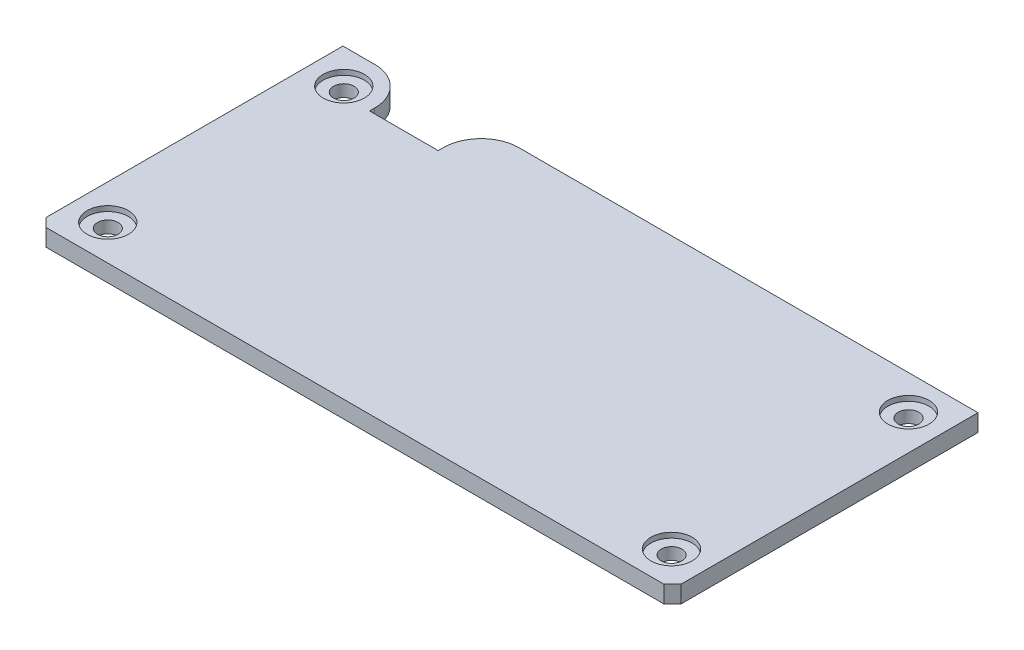
ISO-10303-21;
HEADER;
FILE_DESCRIPTION(('STEP AP214'),'2;1');
FILE_NAME('part.step','',(''),(''),'','','');
FILE_SCHEMA(('AUTOMOTIVE_DESIGN { 1 0 10303 214 1 1 1 1 }'));
ENDSEC;
DATA;
#1=APPLICATION_CONTEXT('core data for automotive mechanical design processes');
#2=APPLICATION_PROTOCOL_DEFINITION('international standard','automotive_design',2000,#1);
#3=PRODUCT_CONTEXT('',#1,'mechanical');
#4=PRODUCT('Part','Part','',(#3));
#5=PRODUCT_RELATED_PRODUCT_CATEGORY('part','',(#4));
#6=PRODUCT_DEFINITION_FORMATION('','',#4);
#7=PRODUCT_DEFINITION_CONTEXT('part definition',#1,'design');
#8=PRODUCT_DEFINITION('design','',#6,#7);
#9=PRODUCT_DEFINITION_SHAPE('','',#8);
#10=(LENGTH_UNIT() NAMED_UNIT(*) SI_UNIT(.MILLI.,.METRE.));
#11=(NAMED_UNIT(*) PLANE_ANGLE_UNIT() SI_UNIT($,.RADIAN.));
#12=(NAMED_UNIT(*) SI_UNIT($,.STERADIAN.) SOLID_ANGLE_UNIT());
#13=UNCERTAINTY_MEASURE_WITH_UNIT(LENGTH_MEASURE(1.E-05),#10,'distance_accuracy_value','');
#14=(GEOMETRIC_REPRESENTATION_CONTEXT(3) GLOBAL_UNCERTAINTY_ASSIGNED_CONTEXT((#13)) GLOBAL_UNIT_ASSIGNED_CONTEXT((#10,
#11,#12)) REPRESENTATION_CONTEXT('',''));
#15=CARTESIAN_POINT('',(0.,0.,0.));
#16=DIRECTION('',(0.,0.,1.));
#17=DIRECTION('',(1.,0.,0.));
#18=AXIS2_PLACEMENT_3D('',#15,#16,#17);
#19=CARTESIAN_POINT('',(-37.,2.,-17.8));
#20=DIRECTION('',(0.,0.,1.));
#21=DIRECTION('',(1.,0.,0.));
#22=AXIS2_PLACEMENT_3D('',#19,#20,#21);
#23=PLANE('',#22);
#24=DIRECTION('',(-1.,0.,0.));
#25=VECTOR('',#24,1.);
#26=CARTESIAN_POINT('',(-37.,0.,-17.8));
#27=LINE('',#26,#25);
#28=CARTESIAN_POINT('',(37.,0.,-17.8));
#29=VERTEX_POINT('',#28);
#30=CARTESIAN_POINT('',(-16.5,0.,-17.8));
#31=VERTEX_POINT('',#30);
#32=EDGE_CURVE('E242',#29,#31,#27,.T.);
#33=ORIENTED_EDGE('',*,*,#32,.T.);
#34=DIRECTION('',(0.,1.,0.));
#35=VECTOR('',#34,1.);
#36=CARTESIAN_POINT('',(-16.5,2.,-17.8));
#37=LINE('',#36,#35);
#38=CARTESIAN_POINT('',(-16.5,2.,-17.8));
#39=VERTEX_POINT('',#38);
#40=EDGE_CURVE('E286',#31,#39,#37,.T.);
#41=ORIENTED_EDGE('',*,*,#40,.T.);
#42=DIRECTION('',(-1.,0.,0.));
#43=VECTOR('',#42,1.);
#44=CARTESIAN_POINT('',(-37.,2.,-17.8));
#45=LINE('',#44,#43);
#46=CARTESIAN_POINT('',(37.,2.,-17.8));
#47=VERTEX_POINT('',#46);
#48=EDGE_CURVE('E226',#47,#39,#45,.T.);
#49=ORIENTED_EDGE('',*,*,#48,.F.);
#50=DIRECTION('',(0.,-1.,0.));
#51=VECTOR('',#50,1.);
#52=CARTESIAN_POINT('',(37.,2.,-17.8));
#53=LINE('',#52,#51);
#54=EDGE_CURVE('E256',#47,#29,#53,.T.);
#55=ORIENTED_EDGE('',*,*,#54,.T.);
#56=EDGE_LOOP('',(#33,#41,#49,#55));
#57=FACE_BOUND('',#56,.T.);
#58=ADVANCED_FACE('F41',(#57),#23,.F.);
#59=CARTESIAN_POINT('',(32.9045607646162,0.,13.813886845355));
#60=DIRECTION('',(0.,1.,0.));
#61=DIRECTION('',(0.,0.,1.));
#62=AXIS2_PLACEMENT_3D('',#59,#60,#61);
#63=CYLINDRICAL_SURFACE('',#62,1.2);
#64=CARTESIAN_POINT('',(32.9045607646162,0.,13.813886845355));
#65=DIRECTION('',(0.,1.,0.));
#66=DIRECTION('',(0.,0.,1.));
#67=AXIS2_PLACEMENT_3D('',#64,#65,#66);
#68=CIRCLE('',#67,1.2);
#69=CARTESIAN_POINT('',(32.9045607646162,0.,15.013886845355));
#70=VERTEX_POINT('',#69);
#71=EDGE_CURVE('E207',#70,#70,#68,.T.);
#72=ORIENTED_EDGE('',*,*,#71,.F.);
#73=EDGE_LOOP('',(#72));
#74=FACE_BOUND('',#73,.T.);
#75=CARTESIAN_POINT('',(32.9045607646162,1.4,13.813886845355));
#76=DIRECTION('',(0.,1.,0.));
#77=DIRECTION('',(0.,0.,1.));
#78=AXIS2_PLACEMENT_3D('',#75,#76,#77);
#79=CIRCLE('',#78,1.2);
#80=CARTESIAN_POINT('',(32.9045607646162,1.4,15.013886845355));
#81=VERTEX_POINT('',#80);
#82=EDGE_CURVE('E216',#81,#81,#79,.F.);
#83=ORIENTED_EDGE('',*,*,#82,.F.);
#84=EDGE_LOOP('',(#83));
#85=FACE_BOUND('',#84,.T.);
#86=ADVANCED_FACE('F364',(#74,#85),#63,.F.);
#87=CARTESIAN_POINT('',(-32.9,0.,13.7));
#88=DIRECTION('',(0.,1.,0.));
#89=DIRECTION('',(0.,0.,1.));
#90=AXIS2_PLACEMENT_3D('',#87,#88,#89);
#91=CYLINDRICAL_SURFACE('',#90,1.2);
#92=CARTESIAN_POINT('',(-32.9,0.,13.7));
#93=DIRECTION('',(0.,1.,0.));
#94=DIRECTION('',(0.,0.,1.));
#95=AXIS2_PLACEMENT_3D('',#92,#93,#94);
#96=CIRCLE('',#95,1.2);
#97=CARTESIAN_POINT('',(-32.9,0.,14.9));
#98=VERTEX_POINT('',#97);
#99=EDGE_CURVE('E203',#98,#98,#96,.T.);
#100=ORIENTED_EDGE('',*,*,#99,.F.);
#101=EDGE_LOOP('',(#100));
#102=FACE_BOUND('',#101,.T.);
#103=CARTESIAN_POINT('',(-32.9,1.4,13.7));
#104=DIRECTION('',(0.,1.,0.));
#105=DIRECTION('',(0.,0.,1.));
#106=AXIS2_PLACEMENT_3D('',#103,#104,#105);
#107=CIRCLE('',#106,1.2);
#108=CARTESIAN_POINT('',(-32.9,1.4,14.9));
#109=VERTEX_POINT('',#108);
#110=EDGE_CURVE('E294',#109,#109,#107,.F.);
#111=ORIENTED_EDGE('',*,*,#110,.F.);
#112=EDGE_LOOP('',(#111));
#113=FACE_BOUND('',#112,.T.);
#114=ADVANCED_FACE('F369',(#102,#113),#91,.F.);
#115=CARTESIAN_POINT('',(-32.9,0.,-13.7990980076637));
#116=DIRECTION('',(0.,1.,0.));
#117=DIRECTION('',(0.,0.,1.));
#118=AXIS2_PLACEMENT_3D('',#115,#116,#117);
#119=CYLINDRICAL_SURFACE('',#118,1.2);
#120=CARTESIAN_POINT('',(-32.9,0.,-13.7990980076637));
#121=DIRECTION('',(0.,1.,0.));
#122=DIRECTION('',(0.,0.,1.));
#123=AXIS2_PLACEMENT_3D('',#120,#121,#122);
#124=CIRCLE('',#123,1.2);
#125=CARTESIAN_POINT('',(-32.9,0.,-12.5990980076637));
#126=VERTEX_POINT('',#125);
#127=EDGE_CURVE('E208',#126,#126,#124,.T.);
#128=ORIENTED_EDGE('',*,*,#127,.F.);
#129=EDGE_LOOP('',(#128));
#130=FACE_BOUND('',#129,.T.);
#131=CARTESIAN_POINT('',(-32.9,1.4,-13.7990980076637));
#132=DIRECTION('',(0.,1.,0.));
#133=DIRECTION('',(0.,0.,1.));
#134=AXIS2_PLACEMENT_3D('',#131,#132,#133);
#135=CIRCLE('',#134,1.2);
#136=CARTESIAN_POINT('',(-32.9,1.4,-12.5990980076637));
#137=VERTEX_POINT('',#136);
#138=EDGE_CURVE('E290',#137,#137,#135,.F.);
#139=ORIENTED_EDGE('',*,*,#138,.F.);
#140=EDGE_LOOP('',(#139));
#141=FACE_BOUND('',#140,.T.);
#142=ADVANCED_FACE('F383',(#130,#141),#119,.F.);
#143=CARTESIAN_POINT('',(32.9,0.,-13.7990980076637));
#144=DIRECTION('',(0.,1.,0.));
#145=DIRECTION('',(0.,0.,1.));
#146=AXIS2_PLACEMENT_3D('',#143,#144,#145);
#147=CYLINDRICAL_SURFACE('',#146,1.2);
#148=CARTESIAN_POINT('',(32.9,0.,-13.7990980076637));
#149=DIRECTION('',(0.,1.,0.));
#150=DIRECTION('',(0.,0.,1.));
#151=AXIS2_PLACEMENT_3D('',#148,#149,#150);
#152=CIRCLE('',#151,1.2);
#153=CARTESIAN_POINT('',(32.9,0.,-12.5990980076637));
#154=VERTEX_POINT('',#153);
#155=EDGE_CURVE('E212',#154,#154,#152,.T.);
#156=ORIENTED_EDGE('',*,*,#155,.F.);
#157=EDGE_LOOP('',(#156));
#158=FACE_BOUND('',#157,.T.);
#159=CARTESIAN_POINT('',(32.9,1.4,-13.7990980076637));
#160=DIRECTION('',(0.,1.,0.));
#161=DIRECTION('',(0.,0.,1.));
#162=AXIS2_PLACEMENT_3D('',#159,#160,#161);
#163=CIRCLE('',#162,1.2);
#164=CARTESIAN_POINT('',(32.9,1.4,-12.5990980076637));
#165=VERTEX_POINT('',#164);
#166=EDGE_CURVE('E199',#165,#165,#163,.F.);
#167=ORIENTED_EDGE('',*,*,#166,.F.);
#168=EDGE_LOOP('',(#167));
#169=FACE_BOUND('',#168,.T.);
#170=ADVANCED_FACE('F379',(#158,#169),#147,.F.);
#171=CARTESIAN_POINT('',(37.,2.,-17.8));
#172=DIRECTION('',(-1.,0.,0.));
#173=DIRECTION('',(0.,0.,1.));
#174=AXIS2_PLACEMENT_3D('',#171,#172,#173);
#175=PLANE('',#174);
#176=DIRECTION('',(0.,0.,-1.));
#177=VECTOR('',#176,1.);
#178=CARTESIAN_POINT('',(37.,2.,-17.8));
#179=LINE('',#178,#177);
#180=CARTESIAN_POINT('',(37.,2.,16.8));
#181=VERTEX_POINT('',#180);
#182=EDGE_CURVE('E221',#181,#47,#179,.T.);
#183=ORIENTED_EDGE('',*,*,#182,.F.);
#184=DIRECTION('',(0.,-1.,0.));
#185=VECTOR('',#184,1.);
#186=CARTESIAN_POINT('',(37.,2.,16.8));
#187=LINE('',#186,#185);
#188=CARTESIAN_POINT('',(37.,0.,16.8));
#189=VERTEX_POINT('',#188);
#190=EDGE_CURVE('E260',#181,#189,#187,.T.);
#191=ORIENTED_EDGE('',*,*,#190,.T.);
#192=DIRECTION('',(0.,0.,-1.));
#193=VECTOR('',#192,1.);
#194=CARTESIAN_POINT('',(37.,0.,-17.8));
#195=LINE('',#194,#193);
#196=EDGE_CURVE('E220',#189,#29,#195,.T.);
#197=ORIENTED_EDGE('',*,*,#196,.T.);
#198=ORIENTED_EDGE('',*,*,#54,.F.);
#199=EDGE_LOOP('',(#183,#191,#197,#198));
#200=FACE_BOUND('',#199,.T.);
#201=ADVANCED_FACE('F336',(#200),#175,.F.);
#202=CARTESIAN_POINT('',(-33.3,2.,-17.8));
#203=VERTEX_POINT('',#202);
#204=CARTESIAN_POINT('',(-37.,2.,-17.8));
#205=VERTEX_POINT('',#204);
#206=EDGE_CURVE('E224',#203,#205,#45,.T.);
#207=ORIENTED_EDGE('',*,*,#206,.F.);
#208=DIRECTION('',(0.,1.,0.));
#209=VECTOR('',#208,1.);
#210=CARTESIAN_POINT('',(-33.3,2.,-17.8));
#211=LINE('',#210,#209);
#212=CARTESIAN_POINT('',(-33.3,0.,-17.8));
#213=VERTEX_POINT('',#212);
#214=EDGE_CURVE('E11',#203,#213,#211,.F.);
#215=ORIENTED_EDGE('',*,*,#214,.T.);
#216=CARTESIAN_POINT('',(-37.,0.,-17.8));
#217=VERTEX_POINT('',#216);
#218=EDGE_CURVE('E241',#213,#217,#27,.T.);
#219=ORIENTED_EDGE('',*,*,#218,.T.);
#220=DIRECTION('',(0.,-1.,0.));
#221=VECTOR('',#220,1.);
#222=CARTESIAN_POINT('',(-37.,2.,-17.8));
#223=LINE('',#222,#221);
#224=EDGE_CURVE('E238',#205,#217,#223,.T.);
#225=ORIENTED_EDGE('',*,*,#224,.F.);
#226=EDGE_LOOP('',(#207,#215,#219,#225));
#227=FACE_BOUND('',#226,.T.);
#228=ADVANCED_FACE('F356',(#227),#23,.F.);
#229=CARTESIAN_POINT('',(-37.,2.,-17.8));
#230=DIRECTION('',(1.,0.,0.));
#231=DIRECTION('',(0.,0.,-1.));
#232=AXIS2_PLACEMENT_3D('',#229,#230,#231);
#233=PLANE('',#232);
#234=DIRECTION('',(0.,0.,1.));
#235=VECTOR('',#234,1.);
#236=CARTESIAN_POINT('',(-37.,0.,-17.8));
#237=LINE('',#236,#235);
#238=CARTESIAN_POINT('',(-37.,0.,16.8));
#239=VERTEX_POINT('',#238);
#240=EDGE_CURVE('E246',#217,#239,#237,.T.);
#241=ORIENTED_EDGE('',*,*,#240,.T.);
#242=DIRECTION('',(0.,1.,0.));
#243=VECTOR('',#242,1.);
#244=CARTESIAN_POINT('',(-37.,2.,16.8));
#245=LINE('',#244,#243);
#246=CARTESIAN_POINT('',(-37.,2.,16.8));
#247=VERTEX_POINT('',#246);
#248=EDGE_CURVE('E283',#239,#247,#245,.T.);
#249=ORIENTED_EDGE('',*,*,#248,.T.);
#250=DIRECTION('',(0.,0.,1.));
#251=VECTOR('',#250,1.);
#252=CARTESIAN_POINT('',(-37.,2.,-17.8));
#253=LINE('',#252,#251);
#254=EDGE_CURVE('E230',#205,#247,#253,.T.);
#255=ORIENTED_EDGE('',*,*,#254,.F.);
#256=ORIENTED_EDGE('',*,*,#224,.T.);
#257=EDGE_LOOP('',(#241,#249,#255,#256));
#258=FACE_BOUND('',#257,.T.);
#259=ADVANCED_FACE('F353',(#258),#233,.F.);
#260=CARTESIAN_POINT('',(-37.,2.,17.8));
#261=DIRECTION('',(0.,0.,-1.));
#262=DIRECTION('',(-1.,0.,0.));
#263=AXIS2_PLACEMENT_3D('',#260,#261,#262);
#264=PLANE('',#263);
#265=DIRECTION('',(1.,0.,0.));
#266=VECTOR('',#265,1.);
#267=CARTESIAN_POINT('',(-37.,0.,17.8));
#268=LINE('',#267,#266);
#269=CARTESIAN_POINT('',(-36.,0.,17.8));
#270=VERTEX_POINT('',#269);
#271=CARTESIAN_POINT('',(36.,0.,17.8));
#272=VERTEX_POINT('',#271);
#273=EDGE_CURVE('E225',#270,#272,#268,.T.);
#274=ORIENTED_EDGE('',*,*,#273,.T.);
#275=DIRECTION('',(0.,1.,0.));
#276=VECTOR('',#275,1.);
#277=CARTESIAN_POINT('',(36.,2.,17.8));
#278=LINE('',#277,#276);
#279=CARTESIAN_POINT('',(36.,2.,17.8));
#280=VERTEX_POINT('',#279);
#281=EDGE_CURVE('E274',#272,#280,#278,.T.);
#282=ORIENTED_EDGE('',*,*,#281,.T.);
#283=DIRECTION('',(1.,0.,0.));
#284=VECTOR('',#283,1.);
#285=CARTESIAN_POINT('',(-37.,2.,17.8));
#286=LINE('',#285,#284);
#287=CARTESIAN_POINT('',(-36.,2.,17.8));
#288=VERTEX_POINT('',#287);
#289=EDGE_CURVE('E234',#288,#280,#286,.T.);
#290=ORIENTED_EDGE('',*,*,#289,.F.);
#291=DIRECTION('',(0.,-1.,0.));
#292=VECTOR('',#291,1.);
#293=CARTESIAN_POINT('',(-36.,2.,17.8));
#294=LINE('',#293,#292);
#295=EDGE_CURVE('E270',#288,#270,#294,.T.);
#296=ORIENTED_EDGE('',*,*,#295,.T.);
#297=EDGE_LOOP('',(#274,#282,#290,#296));
#298=FACE_BOUND('',#297,.T.);
#299=ADVANCED_FACE('F342',(#298),#264,.F.);
#300=CARTESIAN_POINT('',(0.,2.,0.));
#301=DIRECTION('',(0.,1.,0.));
#302=DIRECTION('',(0.,0.,1.));
#303=AXIS2_PLACEMENT_3D('',#300,#301,#302);
#304=PLANE('',#303);
#305=ORIENTED_EDGE('',*,*,#48,.T.);
#306=CARTESIAN_POINT('',(-16.5,2.,-13.4));
#307=DIRECTION('',(0.,1.,0.));
#308=DIRECTION('',(0.,0.,1.));
#309=AXIS2_PLACEMENT_3D('',#306,#307,#308);
#310=CIRCLE('',#309,4.4);
#311=CARTESIAN_POINT('',(-20.9,2.,-13.4));
#312=VERTEX_POINT('',#311);
#313=EDGE_CURVE('E307',#39,#312,#310,.T.);
#314=ORIENTED_EDGE('',*,*,#313,.T.);
#315=DIRECTION('',(0.,0.,-1.));
#316=VECTOR('',#315,1.);
#317=CARTESIAN_POINT('',(-20.9,2.,-12.8));
#318=LINE('',#317,#316);
#319=CARTESIAN_POINT('',(-20.9,2.,-12.8));
#320=VERTEX_POINT('',#319);
#321=EDGE_CURVE('E163',#320,#312,#318,.T.);
#322=ORIENTED_EDGE('',*,*,#321,.F.);
#323=DIRECTION('',(1.,0.,0.));
#324=VECTOR('',#323,1.);
#325=CARTESIAN_POINT('',(-20.9,2.,-12.8));
#326=LINE('',#325,#324);
#327=CARTESIAN_POINT('',(-28.9,2.,-12.8));
#328=VERTEX_POINT('',#327);
#329=EDGE_CURVE('E138',#328,#320,#326,.T.);
#330=ORIENTED_EDGE('',*,*,#329,.F.);
#331=DIRECTION('',(0.,0.,1.));
#332=VECTOR('',#331,1.);
#333=CARTESIAN_POINT('',(-28.9,2.,-12.8));
#334=LINE('',#333,#332);
#335=CARTESIAN_POINT('',(-28.9,2.,-13.4));
#336=VERTEX_POINT('',#335);
#337=EDGE_CURVE('E166',#336,#328,#334,.T.);
#338=ORIENTED_EDGE('',*,*,#337,.F.);
#339=CARTESIAN_POINT('',(-33.3,2.,-13.4));
#340=DIRECTION('',(0.,1.,0.));
#341=DIRECTION('',(0.,0.,1.));
#342=AXIS2_PLACEMENT_3D('',#339,#340,#341);
#343=CIRCLE('',#342,4.4);
#344=EDGE_CURVE('E304',#336,#203,#343,.T.);
#345=ORIENTED_EDGE('',*,*,#344,.T.);
#346=ORIENTED_EDGE('',*,*,#206,.T.);
#347=ORIENTED_EDGE('',*,*,#254,.T.);
#348=DIRECTION('',(-0.707106781186543,0.,-0.707106781186552));
#349=VECTOR('',#348,1.);
#350=CARTESIAN_POINT('',(-26.9000000000003,2.,26.8999999999999));
#351=LINE('',#350,#349);
#352=EDGE_CURVE('E277',#247,#288,#351,.F.);
#353=ORIENTED_EDGE('',*,*,#352,.T.);
#354=ORIENTED_EDGE('',*,*,#289,.T.);
#355=DIRECTION('',(-0.707106781186552,0.,0.707106781186543));
#356=VECTOR('',#355,1.);
#357=CARTESIAN_POINT('',(26.8999999999997,2.,26.9000000000001));
#358=LINE('',#357,#356);
#359=EDGE_CURVE('E280',#280,#181,#358,.F.);
#360=ORIENTED_EDGE('',*,*,#359,.T.);
#361=ORIENTED_EDGE('',*,*,#182,.T.);
#362=EDGE_LOOP('',(#305,#314,#322,#330,#338,#345,#346,#347,#353,#354,#360,#361));
#363=FACE_BOUND('',#362,.T.);
#364=CARTESIAN_POINT('',(-32.9,2.,13.7));
#365=DIRECTION('',(0.,1.,0.));
#366=DIRECTION('',(0.,0.,1.));
#367=AXIS2_PLACEMENT_3D('',#364,#365,#366);
#368=CIRCLE('',#367,2.4);
#369=CARTESIAN_POINT('',(-32.9,2.,16.1));
#370=VERTEX_POINT('',#369);
#371=EDGE_CURVE('E184',#370,#370,#368,.T.);
#372=ORIENTED_EDGE('',*,*,#371,.F.);
#373=EDGE_LOOP('',(#372));
#374=FACE_BOUND('',#373,.T.);
#375=CARTESIAN_POINT('',(32.9,2.,-13.7990980076637));
#376=DIRECTION('',(0.,1.,0.));
#377=DIRECTION('',(0.,0.,1.));
#378=AXIS2_PLACEMENT_3D('',#375,#376,#377);
#379=CIRCLE('',#378,2.4);
#380=CARTESIAN_POINT('',(32.9,2.,-11.3990980076637));
#381=VERTEX_POINT('',#380);
#382=EDGE_CURVE('E175',#381,#381,#379,.T.);
#383=ORIENTED_EDGE('',*,*,#382,.F.);
#384=EDGE_LOOP('',(#383));
#385=FACE_BOUND('',#384,.T.);
#386=CARTESIAN_POINT('',(-32.9,2.,-13.7990980076637));
#387=DIRECTION('',(0.,1.,0.));
#388=DIRECTION('',(0.,0.,1.));
#389=AXIS2_PLACEMENT_3D('',#386,#387,#388);
#390=CIRCLE('',#389,2.4);
#391=CARTESIAN_POINT('',(-32.9,2.,-11.3990980076637));
#392=VERTEX_POINT('',#391);
#393=EDGE_CURVE('E143',#392,#392,#390,.T.);
#394=ORIENTED_EDGE('',*,*,#393,.F.);
#395=EDGE_LOOP('',(#394));
#396=FACE_BOUND('',#395,.T.);
#397=CARTESIAN_POINT('',(32.9045607646162,2.,13.813886845355));
#398=DIRECTION('',(0.,1.,0.));
#399=DIRECTION('',(0.,0.,1.));
#400=AXIS2_PLACEMENT_3D('',#397,#398,#399);
#401=CIRCLE('',#400,2.4);
#402=CARTESIAN_POINT('',(32.9045607646162,2.,16.213886845355));
#403=VERTEX_POINT('',#402);
#404=EDGE_CURVE('E183',#403,#403,#401,.T.);
#405=ORIENTED_EDGE('',*,*,#404,.F.);
#406=EDGE_LOOP('',(#405));
#407=FACE_BOUND('',#406,.T.);
#408=ADVANCED_FACE('F324',(#363,#374,#385,#396,#407),#304,.T.);
#409=CARTESIAN_POINT('',(0.,0.,0.));
#410=DIRECTION('',(0.,1.,0.));
#411=DIRECTION('',(0.,0.,1.));
#412=AXIS2_PLACEMENT_3D('',#409,#410,#411);
#413=PLANE('',#412);
#414=ORIENTED_EDGE('',*,*,#155,.T.);
#415=EDGE_LOOP('',(#414));
#416=FACE_BOUND('',#415,.T.);
#417=ORIENTED_EDGE('',*,*,#127,.T.);
#418=EDGE_LOOP('',(#417));
#419=FACE_BOUND('',#418,.T.);
#420=ORIENTED_EDGE('',*,*,#99,.T.);
#421=EDGE_LOOP('',(#420));
#422=FACE_BOUND('',#421,.T.);
#423=ORIENTED_EDGE('',*,*,#71,.T.);
#424=EDGE_LOOP('',(#423));
#425=FACE_BOUND('',#424,.T.);
#426=DIRECTION('',(0.,0.,-1.));
#427=VECTOR('',#426,1.);
#428=CARTESIAN_POINT('',(-20.9,0.,-12.8));
#429=LINE('',#428,#427);
#430=CARTESIAN_POINT('',(-20.9,0.,-12.8));
#431=VERTEX_POINT('',#430);
#432=CARTESIAN_POINT('',(-20.9,0.,-13.4));
#433=VERTEX_POINT('',#432);
#434=EDGE_CURVE('E147',#431,#433,#429,.T.);
#435=ORIENTED_EDGE('',*,*,#434,.T.);
#436=CARTESIAN_POINT('',(-16.5,0.,-13.4));
#437=DIRECTION('',(0.,1.,0.));
#438=DIRECTION('',(0.,0.,1.));
#439=AXIS2_PLACEMENT_3D('',#436,#437,#438);
#440=CIRCLE('',#439,4.4);
#441=EDGE_CURVE('E314',#433,#31,#440,.F.);
#442=ORIENTED_EDGE('',*,*,#441,.T.);
#443=ORIENTED_EDGE('',*,*,#32,.F.);
#444=ORIENTED_EDGE('',*,*,#196,.F.);
#445=DIRECTION('',(0.707106781186552,0.,-0.707106781186543));
#446=VECTOR('',#445,1.);
#447=CARTESIAN_POINT('',(37.,0.,16.8));
#448=LINE('',#447,#446);
#449=EDGE_CURVE('E267',#189,#272,#448,.F.);
#450=ORIENTED_EDGE('',*,*,#449,.T.);
#451=ORIENTED_EDGE('',*,*,#273,.F.);
#452=DIRECTION('',(0.707106781186543,0.,0.707106781186552));
#453=VECTOR('',#452,1.);
#454=CARTESIAN_POINT('',(-36.,0.,17.8));
#455=LINE('',#454,#453);
#456=EDGE_CURVE('E264',#270,#239,#455,.F.);
#457=ORIENTED_EDGE('',*,*,#456,.T.);
#458=ORIENTED_EDGE('',*,*,#240,.F.);
#459=ORIENTED_EDGE('',*,*,#218,.F.);
#460=CARTESIAN_POINT('',(-33.3,0.,-13.4));
#461=DIRECTION('',(0.,1.,0.));
#462=DIRECTION('',(0.,0.,1.));
#463=AXIS2_PLACEMENT_3D('',#460,#461,#462);
#464=CIRCLE('',#463,4.4);
#465=CARTESIAN_POINT('',(-28.9,0.,-13.4));
#466=VERTEX_POINT('',#465);
#467=EDGE_CURVE('E57',#213,#466,#464,.F.);
#468=ORIENTED_EDGE('',*,*,#467,.T.);
#469=DIRECTION('',(0.,0.,1.));
#470=VECTOR('',#469,1.);
#471=CARTESIAN_POINT('',(-28.9,0.,-12.8));
#472=LINE('',#471,#470);
#473=CARTESIAN_POINT('',(-28.9,0.,-12.8));
#474=VERTEX_POINT('',#473);
#475=EDGE_CURVE('E153',#466,#474,#472,.T.);
#476=ORIENTED_EDGE('',*,*,#475,.T.);
#477=DIRECTION('',(1.,0.,0.));
#478=VECTOR('',#477,1.);
#479=CARTESIAN_POINT('',(-20.9,0.,-12.8));
#480=LINE('',#479,#478);
#481=EDGE_CURVE('E135',#474,#431,#480,.T.);
#482=ORIENTED_EDGE('',*,*,#481,.T.);
#483=EDGE_LOOP('',(#435,#442,#443,#444,#450,#451,#457,#458,#459,#468,#476,#482));
#484=FACE_BOUND('',#483,.T.);
#485=ADVANCED_FACE('F155',(#416,#419,#422,#425,#484),#413,.F.);
#486=CARTESIAN_POINT('',(37.,2.,16.8));
#487=DIRECTION('',(-0.707106781186542,0.,-0.707106781186552));
#488=DIRECTION('',(0.,-1.,0.));
#489=AXIS2_PLACEMENT_3D('',#486,#487,#488);
#490=PLANE('',#489);
#491=ORIENTED_EDGE('',*,*,#359,.F.);
#492=ORIENTED_EDGE('',*,*,#281,.F.);
#493=ORIENTED_EDGE('',*,*,#449,.F.);
#494=ORIENTED_EDGE('',*,*,#190,.F.);
#495=EDGE_LOOP('',(#491,#492,#493,#494));
#496=FACE_BOUND('',#495,.T.);
#497=ADVANCED_FACE('F346',(#496),#490,.F.);
#498=CARTESIAN_POINT('',(-36.,2.,17.8));
#499=DIRECTION('',(0.707106781186552,0.,-0.707106781186542));
#500=DIRECTION('',(0.,-1.,0.));
#501=AXIS2_PLACEMENT_3D('',#498,#499,#500);
#502=PLANE('',#501);
#503=ORIENTED_EDGE('',*,*,#352,.F.);
#504=ORIENTED_EDGE('',*,*,#248,.F.);
#505=ORIENTED_EDGE('',*,*,#456,.F.);
#506=ORIENTED_EDGE('',*,*,#295,.F.);
#507=EDGE_LOOP('',(#503,#504,#505,#506));
#508=FACE_BOUND('',#507,.T.);
#509=ADVANCED_FACE('F349',(#508),#502,.F.);
#510=CARTESIAN_POINT('',(32.9,1.4,-13.7990980076637));
#511=DIRECTION('',(0.,1.,0.));
#512=DIRECTION('',(0.,0.,1.));
#513=AXIS2_PLACEMENT_3D('',#510,#511,#512);
#514=PLANE('',#513);
#515=CARTESIAN_POINT('',(32.9,1.4,-13.7990980076637));
#516=DIRECTION('',(0.,1.,0.));
#517=DIRECTION('',(0.,0.,1.));
#518=AXIS2_PLACEMENT_3D('',#515,#516,#517);
#519=CIRCLE('',#518,2.4);
#520=CARTESIAN_POINT('',(32.9,1.4,-11.3990980076637));
#521=VERTEX_POINT('',#520);
#522=EDGE_CURVE('E188',#521,#521,#519,.T.);
#523=ORIENTED_EDGE('',*,*,#522,.T.);
#524=EDGE_LOOP('',(#523));
#525=FACE_BOUND('',#524,.T.);
#526=ORIENTED_EDGE('',*,*,#166,.T.);
#527=EDGE_LOOP('',(#526));
#528=FACE_BOUND('',#527,.T.);
#529=ADVANCED_FACE('F396',(#525,#528),#514,.T.);
#530=CARTESIAN_POINT('',(32.9,1.4,-13.7990980076637));
#531=DIRECTION('',(0.,1.,0.));
#532=DIRECTION('',(0.,0.,1.));
#533=AXIS2_PLACEMENT_3D('',#530,#531,#532);
#534=CYLINDRICAL_SURFACE('',#533,2.4);
#535=ORIENTED_EDGE('',*,*,#522,.F.);
#536=EDGE_LOOP('',(#535));
#537=FACE_BOUND('',#536,.T.);
#538=ORIENTED_EDGE('',*,*,#382,.T.);
#539=EDGE_LOOP('',(#538));
#540=FACE_BOUND('',#539,.T.);
#541=ADVANCED_FACE('F400',(#537,#540),#534,.F.);
#542=CARTESIAN_POINT('',(-32.9,1.4,-13.7990980076637));
#543=DIRECTION('',(0.,1.,0.));
#544=DIRECTION('',(0.,0.,1.));
#545=AXIS2_PLACEMENT_3D('',#542,#543,#544);
#546=PLANE('',#545);
#547=CARTESIAN_POINT('',(-32.9,1.4,-13.7990980076637));
#548=DIRECTION('',(0.,1.,0.));
#549=DIRECTION('',(0.,0.,1.));
#550=AXIS2_PLACEMENT_3D('',#547,#548,#549);
#551=CIRCLE('',#550,2.4);
#552=CARTESIAN_POINT('',(-32.9,1.4,-11.3990980076637));
#553=VERTEX_POINT('',#552);
#554=EDGE_CURVE('E171',#553,#553,#551,.T.);
#555=ORIENTED_EDGE('',*,*,#554,.T.);
#556=EDGE_LOOP('',(#555));
#557=FACE_BOUND('',#556,.T.);
#558=ORIENTED_EDGE('',*,*,#138,.T.);
#559=EDGE_LOOP('',(#558));
#560=FACE_BOUND('',#559,.T.);
#561=ADVANCED_FACE('F406',(#557,#560),#546,.T.);
#562=CARTESIAN_POINT('',(-32.9,1.4,-13.7990980076637));
#563=DIRECTION('',(0.,1.,0.));
#564=DIRECTION('',(0.,0.,1.));
#565=AXIS2_PLACEMENT_3D('',#562,#563,#564);
#566=CYLINDRICAL_SURFACE('',#565,2.4);
#567=ORIENTED_EDGE('',*,*,#554,.F.);
#568=EDGE_LOOP('',(#567));
#569=FACE_BOUND('',#568,.T.);
#570=ORIENTED_EDGE('',*,*,#393,.T.);
#571=EDGE_LOOP('',(#570));
#572=FACE_BOUND('',#571,.T.);
#573=ADVANCED_FACE('F498',(#569,#572),#566,.F.);
#574=CARTESIAN_POINT('',(-32.9,1.4,13.7));
#575=DIRECTION('',(0.,1.,0.));
#576=DIRECTION('',(0.,0.,1.));
#577=AXIS2_PLACEMENT_3D('',#574,#575,#576);
#578=PLANE('',#577);
#579=CARTESIAN_POINT('',(-32.9,1.4,13.7));
#580=DIRECTION('',(0.,1.,0.));
#581=DIRECTION('',(0.,0.,1.));
#582=AXIS2_PLACEMENT_3D('',#579,#580,#581);
#583=CIRCLE('',#582,2.4);
#584=CARTESIAN_POINT('',(-32.9,1.4,16.1));
#585=VERTEX_POINT('',#584);
#586=EDGE_CURVE('E179',#585,#585,#583,.T.);
#587=ORIENTED_EDGE('',*,*,#586,.T.);
#588=EDGE_LOOP('',(#587));
#589=FACE_BOUND('',#588,.T.);
#590=ORIENTED_EDGE('',*,*,#110,.T.);
#591=EDGE_LOOP('',(#590));
#592=FACE_BOUND('',#591,.T.);
#593=ADVANCED_FACE('F508',(#589,#592),#578,.T.);
#594=CARTESIAN_POINT('',(-32.9,1.4,13.7));
#595=DIRECTION('',(0.,1.,0.));
#596=DIRECTION('',(0.,0.,1.));
#597=AXIS2_PLACEMENT_3D('',#594,#595,#596);
#598=CYLINDRICAL_SURFACE('',#597,2.4);
#599=ORIENTED_EDGE('',*,*,#586,.F.);
#600=EDGE_LOOP('',(#599));
#601=FACE_BOUND('',#600,.T.);
#602=ORIENTED_EDGE('',*,*,#371,.T.);
#603=EDGE_LOOP('',(#602));
#604=FACE_BOUND('',#603,.T.);
#605=ADVANCED_FACE('F411',(#601,#604),#598,.F.);
#606=CARTESIAN_POINT('',(32.9045607646162,1.4,13.813886845355));
#607=DIRECTION('',(0.,1.,0.));
#608=DIRECTION('',(0.,0.,1.));
#609=AXIS2_PLACEMENT_3D('',#606,#607,#608);
#610=PLANE('',#609);
#611=CARTESIAN_POINT('',(32.9045607646162,1.4,13.813886845355));
#612=DIRECTION('',(0.,1.,0.));
#613=DIRECTION('',(0.,0.,1.));
#614=AXIS2_PLACEMENT_3D('',#611,#612,#613);
#615=CIRCLE('',#614,2.4);
#616=CARTESIAN_POINT('',(32.9045607646162,1.4,16.213886845355));
#617=VERTEX_POINT('',#616);
#618=EDGE_CURVE('E195',#617,#617,#615,.T.);
#619=ORIENTED_EDGE('',*,*,#618,.T.);
#620=EDGE_LOOP('',(#619));
#621=FACE_BOUND('',#620,.T.);
#622=ORIENTED_EDGE('',*,*,#82,.T.);
#623=EDGE_LOOP('',(#622));
#624=FACE_BOUND('',#623,.T.);
#625=ADVANCED_FACE('F414',(#621,#624),#610,.T.);
#626=CARTESIAN_POINT('',(32.9045607646162,1.4,13.813886845355));
#627=DIRECTION('',(0.,1.,0.));
#628=DIRECTION('',(0.,0.,1.));
#629=AXIS2_PLACEMENT_3D('',#626,#627,#628);
#630=CYLINDRICAL_SURFACE('',#629,2.4);
#631=ORIENTED_EDGE('',*,*,#618,.F.);
#632=EDGE_LOOP('',(#631));
#633=FACE_BOUND('',#632,.T.);
#634=ORIENTED_EDGE('',*,*,#404,.T.);
#635=EDGE_LOOP('',(#634));
#636=FACE_BOUND('',#635,.T.);
#637=ADVANCED_FACE('F417',(#633,#636),#630,.F.);
#638=CARTESIAN_POINT('',(-20.9,0.,-12.8));
#639=DIRECTION('',(1.,0.,0.));
#640=DIRECTION('',(0.,0.,-1.));
#641=AXIS2_PLACEMENT_3D('',#638,#639,#640);
#642=PLANE('',#641);
#643=ORIENTED_EDGE('',*,*,#321,.T.);
#644=DIRECTION('',(0.,1.,0.));
#645=VECTOR('',#644,1.);
#646=CARTESIAN_POINT('',(-20.9,0.,-13.4));
#647=LINE('',#646,#645);
#648=EDGE_CURVE('E150',#312,#433,#647,.F.);
#649=ORIENTED_EDGE('',*,*,#648,.T.);
#650=ORIENTED_EDGE('',*,*,#434,.F.);
#651=DIRECTION('',(0.,1.,0.));
#652=VECTOR('',#651,1.);
#653=CARTESIAN_POINT('',(-20.9,0.,-12.8));
#654=LINE('',#653,#652);
#655=EDGE_CURVE('E130',#431,#320,#654,.T.);
#656=ORIENTED_EDGE('',*,*,#655,.T.);
#657=EDGE_LOOP('',(#643,#649,#650,#656));
#658=FACE_BOUND('',#657,.T.);
#659=ADVANCED_FACE('F148',(#658),#642,.F.);
#660=CARTESIAN_POINT('',(-20.9,0.,-12.8));
#661=DIRECTION('',(0.,0.,1.));
#662=DIRECTION('',(1.,0.,0.));
#663=AXIS2_PLACEMENT_3D('',#660,#661,#662);
#664=PLANE('',#663);
#665=ORIENTED_EDGE('',*,*,#329,.T.);
#666=ORIENTED_EDGE('',*,*,#655,.F.);
#667=ORIENTED_EDGE('',*,*,#481,.F.);
#668=DIRECTION('',(0.,1.,0.));
#669=VECTOR('',#668,1.);
#670=CARTESIAN_POINT('',(-28.9,0.,-12.8));
#671=LINE('',#670,#669);
#672=EDGE_CURVE('E144',#474,#328,#671,.T.);
#673=ORIENTED_EDGE('',*,*,#672,.T.);
#674=EDGE_LOOP('',(#665,#666,#667,#673));
#675=FACE_BOUND('',#674,.T.);
#676=ADVANCED_FACE('F132',(#675),#664,.F.);
#677=CARTESIAN_POINT('',(-28.9,0.,-12.8));
#678=DIRECTION('',(-1.,0.,0.));
#679=DIRECTION('',(0.,0.,1.));
#680=AXIS2_PLACEMENT_3D('',#677,#678,#679);
#681=PLANE('',#680);
#682=ORIENTED_EDGE('',*,*,#475,.F.);
#683=DIRECTION('',(0.,1.,0.));
#684=VECTOR('',#683,1.);
#685=CARTESIAN_POINT('',(-28.9,0.,-13.4));
#686=LINE('',#685,#684);
#687=EDGE_CURVE('E50',#466,#336,#686,.T.);
#688=ORIENTED_EDGE('',*,*,#687,.T.);
#689=ORIENTED_EDGE('',*,*,#337,.T.);
#690=ORIENTED_EDGE('',*,*,#672,.F.);
#691=EDGE_LOOP('',(#682,#688,#689,#690));
#692=FACE_BOUND('',#691,.T.);
#693=ADVANCED_FACE('F321',(#692),#681,.F.);
#694=CARTESIAN_POINT('',(-16.5,2.,-13.4));
#695=DIRECTION('',(0.,1.,0.));
#696=DIRECTION('',(0.,0.,1.));
#697=AXIS2_PLACEMENT_3D('',#694,#695,#696);
#698=CYLINDRICAL_SURFACE('',#697,4.4);
#699=ORIENTED_EDGE('',*,*,#441,.F.);
#700=ORIENTED_EDGE('',*,*,#648,.F.);
#701=ORIENTED_EDGE('',*,*,#313,.F.);
#702=ORIENTED_EDGE('',*,*,#40,.F.);
#703=EDGE_LOOP('',(#699,#700,#701,#702));
#704=FACE_BOUND('',#703,.T.);
#705=ADVANCED_FACE('F327',(#704),#698,.T.);
#706=CARTESIAN_POINT('',(-33.3,0.,-13.4));
#707=DIRECTION('',(0.,1.,0.));
#708=DIRECTION('',(0.,0.,1.));
#709=AXIS2_PLACEMENT_3D('',#706,#707,#708);
#710=CYLINDRICAL_SURFACE('',#709,4.4);
#711=ORIENTED_EDGE('',*,*,#467,.F.);
#712=ORIENTED_EDGE('',*,*,#214,.F.);
#713=ORIENTED_EDGE('',*,*,#344,.F.);
#714=ORIENTED_EDGE('',*,*,#687,.F.);
#715=EDGE_LOOP('',(#711,#712,#713,#714));
#716=FACE_BOUND('',#715,.T.);
#717=ADVANCED_FACE('F43',(#716),#710,.T.);
#718=CLOSED_SHELL('',(#58,#86,#114,#142,#170,#201,#228,#259,#299,#408,#485,#497,#509,#529,#541,
#561,#573,#593,#605,#625,#637,#659,#676,#693,#705,#717));
#719=MANIFOLD_SOLID_BREP('B2',#718);
#720=ADVANCED_BREP_SHAPE_REPRESENTATION('',(#18,#719),#14);
#721=SHAPE_DEFINITION_REPRESENTATION(#9,#720);
ENDSEC;
END-ISO-10303-21;
